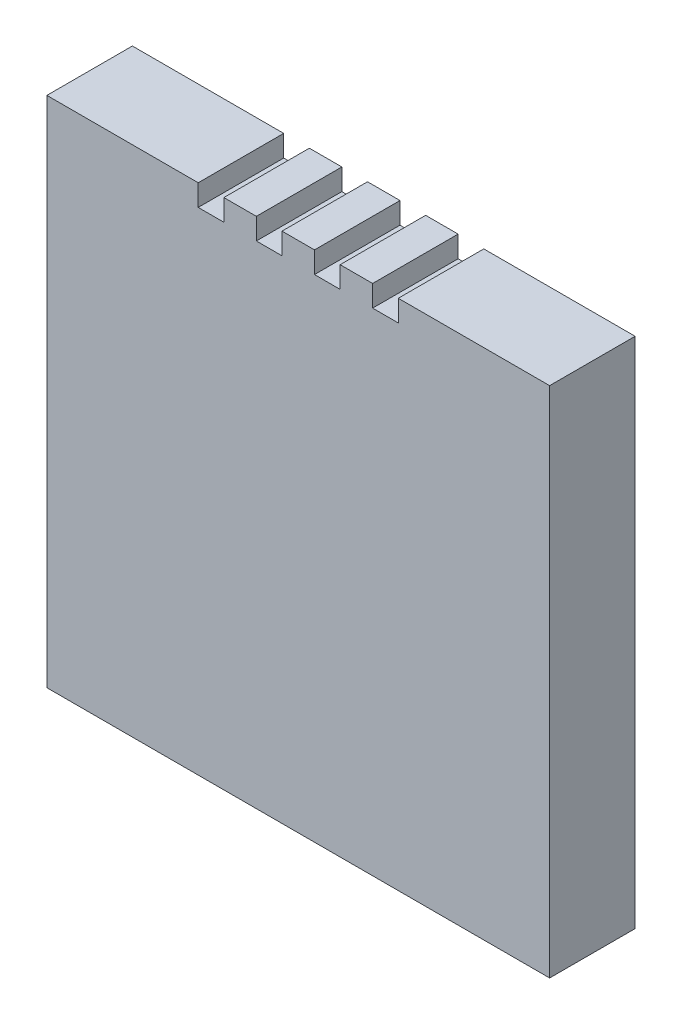
ISO-10303-21;
HEADER;
FILE_DESCRIPTION(('STEP AP214'),'2;1');
FILE_NAME('part.step','',(''),(''),'','','');
FILE_SCHEMA(('AUTOMOTIVE_DESIGN { 1 0 10303 214 1 1 1 1 }'));
ENDSEC;
DATA;
#1=APPLICATION_CONTEXT('core data for automotive mechanical design processes');
#2=APPLICATION_PROTOCOL_DEFINITION('international standard','automotive_design',2000,#1);
#3=PRODUCT_CONTEXT('',#1,'mechanical');
#4=PRODUCT('Part','Part','',(#3));
#5=PRODUCT_RELATED_PRODUCT_CATEGORY('part','',(#4));
#6=PRODUCT_DEFINITION_FORMATION('','',#4);
#7=PRODUCT_DEFINITION_CONTEXT('part definition',#1,'design');
#8=PRODUCT_DEFINITION('design','',#6,#7);
#9=PRODUCT_DEFINITION_SHAPE('','',#8);
#10=(LENGTH_UNIT() NAMED_UNIT(*) SI_UNIT(.MILLI.,.METRE.));
#11=(NAMED_UNIT(*) PLANE_ANGLE_UNIT() SI_UNIT($,.RADIAN.));
#12=(NAMED_UNIT(*) SI_UNIT($,.STERADIAN.) SOLID_ANGLE_UNIT());
#13=UNCERTAINTY_MEASURE_WITH_UNIT(LENGTH_MEASURE(1.E-05),#10,'distance_accuracy_value','');
#14=(GEOMETRIC_REPRESENTATION_CONTEXT(3) GLOBAL_UNCERTAINTY_ASSIGNED_CONTEXT((#13)) GLOBAL_UNIT_ASSIGNED_CONTEXT((#10,
#11,#12)) REPRESENTATION_CONTEXT('',''));
#15=CARTESIAN_POINT('',(0.,0.,0.));
#16=DIRECTION('',(0.,0.,1.));
#17=DIRECTION('',(1.,0.,0.));
#18=AXIS2_PLACEMENT_3D('',#15,#16,#17);
#19=CARTESIAN_POINT('',(0.,0.,2.));
#20=DIRECTION('',(0.,0.,1.));
#21=DIRECTION('',(1.,0.,0.));
#22=AXIS2_PLACEMENT_3D('',#19,#20,#21);
#23=PLANE('',#22);
#24=DIRECTION('',(0.,-1.,0.));
#25=VECTOR('',#24,1.);
#26=CARTESIAN_POINT('',(5.88,0.,2.));
#27=LINE('',#26,#25);
#28=CARTESIAN_POINT('',(5.88,5.99999999999999,2.));
#29=VERTEX_POINT('',#28);
#30=CARTESIAN_POINT('',(5.87999999999999,-6.00000000000001,2.));
#31=VERTEX_POINT('',#30);
#32=EDGE_CURVE('E59',#29,#31,#27,.T.);
#33=ORIENTED_EDGE('',*,*,#32,.F.);
#34=DIRECTION('',(-1.,0.,0.));
#35=VECTOR('',#34,1.);
#36=CARTESIAN_POINT('',(2.34,5.99999999999999,2.));
#37=LINE('',#36,#35);
#38=CARTESIAN_POINT('',(2.34,5.99999999999999,2.));
#39=VERTEX_POINT('',#38);
#40=EDGE_CURVE('E200',#29,#39,#37,.T.);
#41=ORIENTED_EDGE('',*,*,#40,.T.);
#42=DIRECTION('',(0.,-1.,0.));
#43=VECTOR('',#42,1.);
#44=CARTESIAN_POINT('',(2.34,5.49999999999999,2.));
#45=LINE('',#44,#43);
#46=CARTESIAN_POINT('',(2.34,5.49999999999999,2.));
#47=VERTEX_POINT('',#46);
#48=EDGE_CURVE('E205',#39,#47,#45,.T.);
#49=ORIENTED_EDGE('',*,*,#48,.T.);
#50=DIRECTION('',(-1.,0.,0.));
#51=VECTOR('',#50,1.);
#52=CARTESIAN_POINT('',(1.74,5.49999999999999,2.));
#53=LINE('',#52,#51);
#54=CARTESIAN_POINT('',(1.74,5.49999999999999,2.));
#55=VERTEX_POINT('',#54);
#56=EDGE_CURVE('E358',#47,#55,#53,.T.);
#57=ORIENTED_EDGE('',*,*,#56,.T.);
#58=DIRECTION('',(0.,1.,0.));
#59=VECTOR('',#58,1.);
#60=CARTESIAN_POINT('',(1.74,5.99999999999999,2.));
#61=LINE('',#60,#59);
#62=CARTESIAN_POINT('',(1.74,5.99999999999999,2.));
#63=VERTEX_POINT('',#62);
#64=EDGE_CURVE('E361',#55,#63,#61,.T.);
#65=ORIENTED_EDGE('',*,*,#64,.T.);
#66=DIRECTION('',(-1.,0.,0.));
#67=VECTOR('',#66,1.);
#68=CARTESIAN_POINT('',(0.980000000000001,5.99999999999999,2.));
#69=LINE('',#68,#67);
#70=CARTESIAN_POINT('',(0.980000000000001,5.99999999999999,2.));
#71=VERTEX_POINT('',#70);
#72=EDGE_CURVE('E364',#63,#71,#69,.T.);
#73=ORIENTED_EDGE('',*,*,#72,.T.);
#74=DIRECTION('',(0.,-1.,0.));
#75=VECTOR('',#74,1.);
#76=CARTESIAN_POINT('',(0.98,5.49999999999999,2.));
#77=LINE('',#76,#75);
#78=CARTESIAN_POINT('',(0.98,5.49999999999999,2.));
#79=VERTEX_POINT('',#78);
#80=EDGE_CURVE('E367',#71,#79,#77,.T.);
#81=ORIENTED_EDGE('',*,*,#80,.T.);
#82=DIRECTION('',(-1.,0.,0.));
#83=VECTOR('',#82,1.);
#84=CARTESIAN_POINT('',(0.38,5.49999999999999,2.));
#85=LINE('',#84,#83);
#86=CARTESIAN_POINT('',(0.38,5.49999999999999,2.));
#87=VERTEX_POINT('',#86);
#88=EDGE_CURVE('E370',#79,#87,#85,.T.);
#89=ORIENTED_EDGE('',*,*,#88,.T.);
#90=DIRECTION('',(0.,1.,0.));
#91=VECTOR('',#90,1.);
#92=CARTESIAN_POINT('',(0.38,5.99999999999999,2.));
#93=LINE('',#92,#91);
#94=CARTESIAN_POINT('',(0.38,5.99999999999999,2.));
#95=VERTEX_POINT('',#94);
#96=EDGE_CURVE('E373',#87,#95,#93,.T.);
#97=ORIENTED_EDGE('',*,*,#96,.T.);
#98=DIRECTION('',(-1.,0.,0.));
#99=VECTOR('',#98,1.);
#100=CARTESIAN_POINT('',(-0.379999999999999,5.99999999999999,2.));
#101=LINE('',#100,#99);
#102=CARTESIAN_POINT('',(-0.379999999999999,5.99999999999999,2.));
#103=VERTEX_POINT('',#102);
#104=EDGE_CURVE('E376',#95,#103,#101,.T.);
#105=ORIENTED_EDGE('',*,*,#104,.T.);
#106=DIRECTION('',(0.,-1.,0.));
#107=VECTOR('',#106,1.);
#108=CARTESIAN_POINT('',(-0.379999999999999,5.49999999999999,2.));
#109=LINE('',#108,#107);
#110=CARTESIAN_POINT('',(-0.379999999999999,5.49999999999999,2.));
#111=VERTEX_POINT('',#110);
#112=EDGE_CURVE('E379',#103,#111,#109,.T.);
#113=ORIENTED_EDGE('',*,*,#112,.T.);
#114=DIRECTION('',(-1.,0.,0.));
#115=VECTOR('',#114,1.);
#116=CARTESIAN_POINT('',(-0.980000000000001,5.49999999999999,2.));
#117=LINE('',#116,#115);
#118=CARTESIAN_POINT('',(-0.980000000000001,5.49999999999999,2.));
#119=VERTEX_POINT('',#118);
#120=EDGE_CURVE('E382',#111,#119,#117,.T.);
#121=ORIENTED_EDGE('',*,*,#120,.T.);
#122=DIRECTION('',(0.,1.,0.));
#123=VECTOR('',#122,1.);
#124=CARTESIAN_POINT('',(-0.98,5.99999999999999,2.));
#125=LINE('',#124,#123);
#126=CARTESIAN_POINT('',(-0.98,5.99999999999999,2.));
#127=VERTEX_POINT('',#126);
#128=EDGE_CURVE('E385',#119,#127,#125,.T.);
#129=ORIENTED_EDGE('',*,*,#128,.T.);
#130=DIRECTION('',(-1.,0.,0.));
#131=VECTOR('',#130,1.);
#132=CARTESIAN_POINT('',(-1.74,5.99999999999999,2.));
#133=LINE('',#132,#131);
#134=CARTESIAN_POINT('',(-1.74,5.99999999999999,2.));
#135=VERTEX_POINT('',#134);
#136=EDGE_CURVE('E388',#127,#135,#133,.T.);
#137=ORIENTED_EDGE('',*,*,#136,.T.);
#138=DIRECTION('',(0.,-1.,0.));
#139=VECTOR('',#138,1.);
#140=CARTESIAN_POINT('',(-1.74,5.49999999999999,2.));
#141=LINE('',#140,#139);
#142=CARTESIAN_POINT('',(-1.74,5.49999999999999,2.));
#143=VERTEX_POINT('',#142);
#144=EDGE_CURVE('E391',#135,#143,#141,.T.);
#145=ORIENTED_EDGE('',*,*,#144,.T.);
#146=DIRECTION('',(-1.,0.,0.));
#147=VECTOR('',#146,1.);
#148=CARTESIAN_POINT('',(-2.34,5.49999999999999,2.));
#149=LINE('',#148,#147);
#150=CARTESIAN_POINT('',(-2.34,5.49999999999999,2.));
#151=VERTEX_POINT('',#150);
#152=EDGE_CURVE('E394',#143,#151,#149,.T.);
#153=ORIENTED_EDGE('',*,*,#152,.T.);
#154=DIRECTION('',(0.,1.,0.));
#155=VECTOR('',#154,1.);
#156=CARTESIAN_POINT('',(-2.34,5.99999999999999,2.));
#157=LINE('',#156,#155);
#158=CARTESIAN_POINT('',(-2.34,5.99999999999999,2.));
#159=VERTEX_POINT('',#158);
#160=EDGE_CURVE('E397',#151,#159,#157,.T.);
#161=ORIENTED_EDGE('',*,*,#160,.T.);
#162=DIRECTION('',(-1.,0.,0.));
#163=VECTOR('',#162,1.);
#164=CARTESIAN_POINT('',(-10.5,5.99999999999999,2.));
#165=LINE('',#164,#163);
#166=CARTESIAN_POINT('',(-5.88,5.99999999999999,2.));
#167=VERTEX_POINT('',#166);
#168=EDGE_CURVE('E343',#159,#167,#165,.T.);
#169=ORIENTED_EDGE('',*,*,#168,.T.);
#170=DIRECTION('',(0.,1.,0.));
#171=VECTOR('',#170,1.);
#172=CARTESIAN_POINT('',(-5.88,0.,2.));
#173=LINE('',#172,#171);
#174=CARTESIAN_POINT('',(-5.88,-6.00000000000001,2.));
#175=VERTEX_POINT('',#174);
#176=EDGE_CURVE('E349',#175,#167,#173,.T.);
#177=ORIENTED_EDGE('',*,*,#176,.F.);
#178=DIRECTION('',(1.,0.,0.));
#179=VECTOR('',#178,1.);
#180=CARTESIAN_POINT('',(-10.5,-6.00000000000001,2.));
#181=LINE('',#180,#179);
#182=EDGE_CURVE('E217',#175,#31,#181,.T.);
#183=ORIENTED_EDGE('',*,*,#182,.T.);
#184=EDGE_LOOP('',(#33,#41,#49,#57,#65,#73,#81,#89,#97,#105,#113,#121,#129,#137,#145,#153,#161,
#169,#177,#183));
#185=FACE_BOUND('',#184,.T.);
#186=ADVANCED_FACE('F43',(#185),#23,.T.);
#187=CARTESIAN_POINT('',(0.,0.,0.));
#188=DIRECTION('',(0.,0.,1.));
#189=DIRECTION('',(1.,0.,0.));
#190=AXIS2_PLACEMENT_3D('',#187,#188,#189);
#191=PLANE('',#190);
#192=DIRECTION('',(-1.,0.,0.));
#193=VECTOR('',#192,1.);
#194=CARTESIAN_POINT('',(2.34,5.99999999999999,0.));
#195=LINE('',#194,#193);
#196=CARTESIAN_POINT('',(5.88,5.99999999999999,0.));
#197=VERTEX_POINT('',#196);
#198=CARTESIAN_POINT('',(2.34,5.99999999999999,0.));
#199=VERTEX_POINT('',#198);
#200=EDGE_CURVE('E194',#197,#199,#195,.T.);
#201=ORIENTED_EDGE('',*,*,#200,.F.);
#202=DIRECTION('',(0.,1.,0.));
#203=VECTOR('',#202,1.);
#204=CARTESIAN_POINT('',(5.88,-6.00000000000001,0.));
#205=LINE('',#204,#203);
#206=CARTESIAN_POINT('',(5.88,-6.00000000000001,0.));
#207=VERTEX_POINT('',#206);
#208=EDGE_CURVE('E180',#207,#197,#205,.T.);
#209=ORIENTED_EDGE('',*,*,#208,.F.);
#210=DIRECTION('',(1.,0.,0.));
#211=VECTOR('',#210,1.);
#212=CARTESIAN_POINT('',(-10.5,-6.00000000000001,0.));
#213=LINE('',#212,#211);
#214=CARTESIAN_POINT('',(-5.88,-6.00000000000001,0.));
#215=VERTEX_POINT('',#214);
#216=EDGE_CURVE('E192',#215,#207,#213,.T.);
#217=ORIENTED_EDGE('',*,*,#216,.F.);
#218=DIRECTION('',(0.,1.,0.));
#219=VECTOR('',#218,1.);
#220=CARTESIAN_POINT('',(-5.88,-6.00000000000001,0.));
#221=LINE('',#220,#219);
#222=CARTESIAN_POINT('',(-5.88,5.99999999999999,0.));
#223=VERTEX_POINT('',#222);
#224=EDGE_CURVE('E67',#215,#223,#221,.T.);
#225=ORIENTED_EDGE('',*,*,#224,.T.);
#226=DIRECTION('',(-1.,0.,0.));
#227=VECTOR('',#226,1.);
#228=CARTESIAN_POINT('',(-10.5,5.99999999999999,0.));
#229=LINE('',#228,#227);
#230=CARTESIAN_POINT('',(-2.34,5.99999999999999,0.));
#231=VERTEX_POINT('',#230);
#232=EDGE_CURVE('E201',#231,#223,#229,.T.);
#233=ORIENTED_EDGE('',*,*,#232,.F.);
#234=DIRECTION('',(0.,1.,0.));
#235=VECTOR('',#234,1.);
#236=CARTESIAN_POINT('',(-2.34,5.99999999999999,0.));
#237=LINE('',#236,#235);
#238=CARTESIAN_POINT('',(-2.34,5.49999999999999,0.));
#239=VERTEX_POINT('',#238);
#240=EDGE_CURVE('E208',#239,#231,#237,.T.);
#241=ORIENTED_EDGE('',*,*,#240,.F.);
#242=DIRECTION('',(-1.,0.,0.));
#243=VECTOR('',#242,1.);
#244=CARTESIAN_POINT('',(-2.34,5.49999999999999,0.));
#245=LINE('',#244,#243);
#246=CARTESIAN_POINT('',(-1.74,5.49999999999999,0.));
#247=VERTEX_POINT('',#246);
#248=EDGE_CURVE('E327',#247,#239,#245,.T.);
#249=ORIENTED_EDGE('',*,*,#248,.F.);
#250=DIRECTION('',(0.,-1.,0.));
#251=VECTOR('',#250,1.);
#252=CARTESIAN_POINT('',(-1.74,5.49999999999999,0.));
#253=LINE('',#252,#251);
#254=CARTESIAN_POINT('',(-1.74,5.99999999999999,0.));
#255=VERTEX_POINT('',#254);
#256=EDGE_CURVE('E324',#255,#247,#253,.T.);
#257=ORIENTED_EDGE('',*,*,#256,.F.);
#258=DIRECTION('',(-1.,0.,0.));
#259=VECTOR('',#258,1.);
#260=CARTESIAN_POINT('',(-1.74,5.99999999999999,0.));
#261=LINE('',#260,#259);
#262=CARTESIAN_POINT('',(-0.98,5.99999999999999,0.));
#263=VERTEX_POINT('',#262);
#264=EDGE_CURVE('E321',#263,#255,#261,.T.);
#265=ORIENTED_EDGE('',*,*,#264,.F.);
#266=DIRECTION('',(0.,1.,0.));
#267=VECTOR('',#266,1.);
#268=CARTESIAN_POINT('',(-0.98,5.99999999999999,0.));
#269=LINE('',#268,#267);
#270=CARTESIAN_POINT('',(-0.980000000000001,5.49999999999999,0.));
#271=VERTEX_POINT('',#270);
#272=EDGE_CURVE('E318',#271,#263,#269,.T.);
#273=ORIENTED_EDGE('',*,*,#272,.F.);
#274=DIRECTION('',(-1.,0.,0.));
#275=VECTOR('',#274,1.);
#276=CARTESIAN_POINT('',(-0.980000000000001,5.49999999999999,0.));
#277=LINE('',#276,#275);
#278=CARTESIAN_POINT('',(-0.379999999999999,5.49999999999999,0.));
#279=VERTEX_POINT('',#278);
#280=EDGE_CURVE('E315',#279,#271,#277,.T.);
#281=ORIENTED_EDGE('',*,*,#280,.F.);
#282=DIRECTION('',(0.,-1.,0.));
#283=VECTOR('',#282,1.);
#284=CARTESIAN_POINT('',(-0.379999999999999,5.49999999999999,0.));
#285=LINE('',#284,#283);
#286=CARTESIAN_POINT('',(-0.379999999999999,5.99999999999999,0.));
#287=VERTEX_POINT('',#286);
#288=EDGE_CURVE('E312',#287,#279,#285,.T.);
#289=ORIENTED_EDGE('',*,*,#288,.F.);
#290=DIRECTION('',(-1.,0.,0.));
#291=VECTOR('',#290,1.);
#292=CARTESIAN_POINT('',(-0.379999999999999,5.99999999999999,0.));
#293=LINE('',#292,#291);
#294=CARTESIAN_POINT('',(0.38,5.99999999999999,0.));
#295=VERTEX_POINT('',#294);
#296=EDGE_CURVE('E309',#295,#287,#293,.T.);
#297=ORIENTED_EDGE('',*,*,#296,.F.);
#298=DIRECTION('',(0.,1.,0.));
#299=VECTOR('',#298,1.);
#300=CARTESIAN_POINT('',(0.38,5.99999999999999,0.));
#301=LINE('',#300,#299);
#302=CARTESIAN_POINT('',(0.38,5.49999999999999,0.));
#303=VERTEX_POINT('',#302);
#304=EDGE_CURVE('E306',#303,#295,#301,.T.);
#305=ORIENTED_EDGE('',*,*,#304,.F.);
#306=DIRECTION('',(-1.,0.,0.));
#307=VECTOR('',#306,1.);
#308=CARTESIAN_POINT('',(0.38,5.49999999999999,0.));
#309=LINE('',#308,#307);
#310=CARTESIAN_POINT('',(0.98,5.49999999999999,0.));
#311=VERTEX_POINT('',#310);
#312=EDGE_CURVE('E303',#311,#303,#309,.T.);
#313=ORIENTED_EDGE('',*,*,#312,.F.);
#314=DIRECTION('',(0.,-1.,0.));
#315=VECTOR('',#314,1.);
#316=CARTESIAN_POINT('',(0.98,5.49999999999999,0.));
#317=LINE('',#316,#315);
#318=CARTESIAN_POINT('',(0.980000000000001,5.99999999999999,0.));
#319=VERTEX_POINT('',#318);
#320=EDGE_CURVE('E300',#319,#311,#317,.T.);
#321=ORIENTED_EDGE('',*,*,#320,.F.);
#322=DIRECTION('',(-1.,0.,0.));
#323=VECTOR('',#322,1.);
#324=CARTESIAN_POINT('',(0.980000000000001,5.99999999999999,0.));
#325=LINE('',#324,#323);
#326=CARTESIAN_POINT('',(1.74,5.99999999999999,0.));
#327=VERTEX_POINT('',#326);
#328=EDGE_CURVE('E297',#327,#319,#325,.T.);
#329=ORIENTED_EDGE('',*,*,#328,.F.);
#330=DIRECTION('',(0.,1.,0.));
#331=VECTOR('',#330,1.);
#332=CARTESIAN_POINT('',(1.74,5.99999999999999,0.));
#333=LINE('',#332,#331);
#334=CARTESIAN_POINT('',(1.74,5.49999999999999,0.));
#335=VERTEX_POINT('',#334);
#336=EDGE_CURVE('E291',#335,#327,#333,.T.);
#337=ORIENTED_EDGE('',*,*,#336,.F.);
#338=DIRECTION('',(-1.,0.,0.));
#339=VECTOR('',#338,1.);
#340=CARTESIAN_POINT('',(1.74,5.49999999999999,0.));
#341=LINE('',#340,#339);
#342=CARTESIAN_POINT('',(2.34,5.49999999999999,0.));
#343=VERTEX_POINT('',#342);
#344=EDGE_CURVE('E287',#343,#335,#341,.T.);
#345=ORIENTED_EDGE('',*,*,#344,.F.);
#346=DIRECTION('',(0.,-1.,0.));
#347=VECTOR('',#346,1.);
#348=CARTESIAN_POINT('',(2.34,5.49999999999999,0.));
#349=LINE('',#348,#347);
#350=EDGE_CURVE('E279',#199,#343,#349,.T.);
#351=ORIENTED_EDGE('',*,*,#350,.F.);
#352=EDGE_LOOP('',(#201,#209,#217,#225,#233,#241,#249,#257,#265,#273,#281,#289,#297,#305,#313,
#321,#329,#337,#345,#351));
#353=FACE_BOUND('',#352,.T.);
#354=ADVANCED_FACE('F191',(#353),#191,.F.);
#355=CARTESIAN_POINT('',(2.34,5.99999999999999,2.));
#356=DIRECTION('',(0.,-1.,0.));
#357=DIRECTION('',(0.,0.,-1.));
#358=AXIS2_PLACEMENT_3D('',#355,#356,#357);
#359=PLANE('',#358);
#360=ORIENTED_EDGE('',*,*,#40,.F.);
#361=DIRECTION('',(0.,0.,-1.));
#362=VECTOR('',#361,1.);
#363=CARTESIAN_POINT('',(5.88,5.99999999999999,2.));
#364=LINE('',#363,#362);
#365=EDGE_CURVE('E282',#29,#197,#364,.T.);
#366=ORIENTED_EDGE('',*,*,#365,.T.);
#367=ORIENTED_EDGE('',*,*,#200,.T.);
#368=DIRECTION('',(0.,0.,-1.));
#369=VECTOR('',#368,1.);
#370=CARTESIAN_POINT('',(2.34,5.99999999999999,2.));
#371=LINE('',#370,#369);
#372=EDGE_CURVE('E52',#39,#199,#371,.T.);
#373=ORIENTED_EDGE('',*,*,#372,.F.);
#374=EDGE_LOOP('',(#360,#366,#367,#373));
#375=FACE_BOUND('',#374,.T.);
#376=ADVANCED_FACE('F45',(#375),#359,.F.);
#377=CARTESIAN_POINT('',(2.34,5.49999999999999,2.));
#378=DIRECTION('',(1.,0.,0.));
#379=DIRECTION('',(0.,0.,-1.));
#380=AXIS2_PLACEMENT_3D('',#377,#378,#379);
#381=PLANE('',#380);
#382=ORIENTED_EDGE('',*,*,#350,.T.);
#383=DIRECTION('',(0.,0.,-1.));
#384=VECTOR('',#383,1.);
#385=CARTESIAN_POINT('',(2.34,5.49999999999999,2.));
#386=LINE('',#385,#384);
#387=EDGE_CURVE('E269',#47,#343,#386,.T.);
#388=ORIENTED_EDGE('',*,*,#387,.F.);
#389=ORIENTED_EDGE('',*,*,#48,.F.);
#390=ORIENTED_EDGE('',*,*,#372,.T.);
#391=EDGE_LOOP('',(#382,#388,#389,#390));
#392=FACE_BOUND('',#391,.T.);
#393=ADVANCED_FACE('F277',(#392),#381,.F.);
#394=CARTESIAN_POINT('',(1.74,5.49999999999999,2.));
#395=DIRECTION('',(0.,-1.,0.));
#396=DIRECTION('',(1.,0.,0.));
#397=AXIS2_PLACEMENT_3D('',#394,#395,#396);
#398=PLANE('',#397);
#399=ORIENTED_EDGE('',*,*,#344,.T.);
#400=DIRECTION('',(0.,0.,-1.));
#401=VECTOR('',#400,1.);
#402=CARTESIAN_POINT('',(1.74,5.49999999999999,2.));
#403=LINE('',#402,#401);
#404=EDGE_CURVE('E265',#55,#335,#403,.T.);
#405=ORIENTED_EDGE('',*,*,#404,.F.);
#406=ORIENTED_EDGE('',*,*,#56,.F.);
#407=ORIENTED_EDGE('',*,*,#387,.T.);
#408=EDGE_LOOP('',(#399,#405,#406,#407));
#409=FACE_BOUND('',#408,.T.);
#410=ADVANCED_FACE('F471',(#409),#398,.F.);
#411=CARTESIAN_POINT('',(1.74,5.99999999999999,2.));
#412=DIRECTION('',(-1.,0.,0.));
#413=DIRECTION('',(0.,-1.,0.));
#414=AXIS2_PLACEMENT_3D('',#411,#412,#413);
#415=PLANE('',#414);
#416=ORIENTED_EDGE('',*,*,#336,.T.);
#417=DIRECTION('',(0.,0.,-1.));
#418=VECTOR('',#417,1.);
#419=CARTESIAN_POINT('',(1.74,5.99999999999999,2.));
#420=LINE('',#419,#418);
#421=EDGE_CURVE('E261',#63,#327,#420,.T.);
#422=ORIENTED_EDGE('',*,*,#421,.F.);
#423=ORIENTED_EDGE('',*,*,#64,.F.);
#424=ORIENTED_EDGE('',*,*,#404,.T.);
#425=EDGE_LOOP('',(#416,#422,#423,#424));
#426=FACE_BOUND('',#425,.T.);
#427=ADVANCED_FACE('F467',(#426),#415,.F.);
#428=CARTESIAN_POINT('',(0.980000000000001,5.99999999999999,2.));
#429=DIRECTION('',(0.,-1.,0.));
#430=DIRECTION('',(0.,0.,-1.));
#431=AXIS2_PLACEMENT_3D('',#428,#429,#430);
#432=PLANE('',#431);
#433=ORIENTED_EDGE('',*,*,#328,.T.);
#434=DIRECTION('',(0.,0.,-1.));
#435=VECTOR('',#434,1.);
#436=CARTESIAN_POINT('',(0.980000000000001,5.99999999999999,2.));
#437=LINE('',#436,#435);
#438=EDGE_CURVE('E257',#71,#319,#437,.T.);
#439=ORIENTED_EDGE('',*,*,#438,.F.);
#440=ORIENTED_EDGE('',*,*,#72,.F.);
#441=ORIENTED_EDGE('',*,*,#421,.T.);
#442=EDGE_LOOP('',(#433,#439,#440,#441));
#443=FACE_BOUND('',#442,.T.);
#444=ADVANCED_FACE('F463',(#443),#432,.F.);
#445=CARTESIAN_POINT('',(0.98,5.49999999999999,2.));
#446=DIRECTION('',(1.,0.,0.));
#447=DIRECTION('',(0.,1.,0.));
#448=AXIS2_PLACEMENT_3D('',#445,#446,#447);
#449=PLANE('',#448);
#450=ORIENTED_EDGE('',*,*,#320,.T.);
#451=DIRECTION('',(0.,0.,-1.));
#452=VECTOR('',#451,1.);
#453=CARTESIAN_POINT('',(0.98,5.49999999999999,2.));
#454=LINE('',#453,#452);
#455=EDGE_CURVE('E253',#79,#311,#454,.T.);
#456=ORIENTED_EDGE('',*,*,#455,.F.);
#457=ORIENTED_EDGE('',*,*,#80,.F.);
#458=ORIENTED_EDGE('',*,*,#438,.T.);
#459=EDGE_LOOP('',(#450,#456,#457,#458));
#460=FACE_BOUND('',#459,.T.);
#461=ADVANCED_FACE('F459',(#460),#449,.F.);
#462=CARTESIAN_POINT('',(0.38,5.49999999999999,2.));
#463=DIRECTION('',(0.,-1.,0.));
#464=DIRECTION('',(1.,0.,0.));
#465=AXIS2_PLACEMENT_3D('',#462,#463,#464);
#466=PLANE('',#465);
#467=ORIENTED_EDGE('',*,*,#312,.T.);
#468=DIRECTION('',(0.,0.,-1.));
#469=VECTOR('',#468,1.);
#470=CARTESIAN_POINT('',(0.38,5.49999999999999,2.));
#471=LINE('',#470,#469);
#472=EDGE_CURVE('E249',#87,#303,#471,.T.);
#473=ORIENTED_EDGE('',*,*,#472,.F.);
#474=ORIENTED_EDGE('',*,*,#88,.F.);
#475=ORIENTED_EDGE('',*,*,#455,.T.);
#476=EDGE_LOOP('',(#467,#473,#474,#475));
#477=FACE_BOUND('',#476,.T.);
#478=ADVANCED_FACE('F455',(#477),#466,.F.);
#479=CARTESIAN_POINT('',(0.38,5.99999999999999,2.));
#480=DIRECTION('',(-1.,0.,0.));
#481=DIRECTION('',(0.,-1.,0.));
#482=AXIS2_PLACEMENT_3D('',#479,#480,#481);
#483=PLANE('',#482);
#484=ORIENTED_EDGE('',*,*,#304,.T.);
#485=DIRECTION('',(0.,0.,-1.));
#486=VECTOR('',#485,1.);
#487=CARTESIAN_POINT('',(0.38,5.99999999999999,2.));
#488=LINE('',#487,#486);
#489=EDGE_CURVE('E245',#95,#295,#488,.T.);
#490=ORIENTED_EDGE('',*,*,#489,.F.);
#491=ORIENTED_EDGE('',*,*,#96,.F.);
#492=ORIENTED_EDGE('',*,*,#472,.T.);
#493=EDGE_LOOP('',(#484,#490,#491,#492));
#494=FACE_BOUND('',#493,.T.);
#495=ADVANCED_FACE('F451',(#494),#483,.F.);
#496=CARTESIAN_POINT('',(-0.379999999999999,5.99999999999999,2.));
#497=DIRECTION('',(0.,-1.,0.));
#498=DIRECTION('',(0.,0.,-1.));
#499=AXIS2_PLACEMENT_3D('',#496,#497,#498);
#500=PLANE('',#499);
#501=ORIENTED_EDGE('',*,*,#296,.T.);
#502=DIRECTION('',(0.,0.,-1.));
#503=VECTOR('',#502,1.);
#504=CARTESIAN_POINT('',(-0.379999999999999,5.99999999999999,2.));
#505=LINE('',#504,#503);
#506=EDGE_CURVE('E241',#103,#287,#505,.T.);
#507=ORIENTED_EDGE('',*,*,#506,.F.);
#508=ORIENTED_EDGE('',*,*,#104,.F.);
#509=ORIENTED_EDGE('',*,*,#489,.T.);
#510=EDGE_LOOP('',(#501,#507,#508,#509));
#511=FACE_BOUND('',#510,.T.);
#512=ADVANCED_FACE('F447',(#511),#500,.F.);
#513=CARTESIAN_POINT('',(-0.379999999999999,5.49999999999999,2.));
#514=DIRECTION('',(1.,0.,0.));
#515=DIRECTION('',(0.,1.,0.));
#516=AXIS2_PLACEMENT_3D('',#513,#514,#515);
#517=PLANE('',#516);
#518=ORIENTED_EDGE('',*,*,#288,.T.);
#519=DIRECTION('',(0.,0.,-1.));
#520=VECTOR('',#519,1.);
#521=CARTESIAN_POINT('',(-0.379999999999999,5.49999999999999,2.));
#522=LINE('',#521,#520);
#523=EDGE_CURVE('E237',#111,#279,#522,.T.);
#524=ORIENTED_EDGE('',*,*,#523,.F.);
#525=ORIENTED_EDGE('',*,*,#112,.F.);
#526=ORIENTED_EDGE('',*,*,#506,.T.);
#527=EDGE_LOOP('',(#518,#524,#525,#526));
#528=FACE_BOUND('',#527,.T.);
#529=ADVANCED_FACE('F443',(#528),#517,.F.);
#530=CARTESIAN_POINT('',(-0.980000000000001,5.49999999999999,2.));
#531=DIRECTION('',(0.,-1.,0.));
#532=DIRECTION('',(0.,0.,-1.));
#533=AXIS2_PLACEMENT_3D('',#530,#531,#532);
#534=PLANE('',#533);
#535=ORIENTED_EDGE('',*,*,#280,.T.);
#536=DIRECTION('',(0.,0.,-1.));
#537=VECTOR('',#536,1.);
#538=CARTESIAN_POINT('',(-0.980000000000001,5.49999999999999,2.));
#539=LINE('',#538,#537);
#540=EDGE_CURVE('E233',#119,#271,#539,.T.);
#541=ORIENTED_EDGE('',*,*,#540,.F.);
#542=ORIENTED_EDGE('',*,*,#120,.F.);
#543=ORIENTED_EDGE('',*,*,#523,.T.);
#544=EDGE_LOOP('',(#535,#541,#542,#543));
#545=FACE_BOUND('',#544,.T.);
#546=ADVANCED_FACE('F439',(#545),#534,.F.);
#547=CARTESIAN_POINT('',(-0.98,5.99999999999999,2.));
#548=DIRECTION('',(-1.,0.,0.));
#549=DIRECTION('',(0.,-1.,0.));
#550=AXIS2_PLACEMENT_3D('',#547,#548,#549);
#551=PLANE('',#550);
#552=ORIENTED_EDGE('',*,*,#272,.T.);
#553=DIRECTION('',(0.,0.,-1.));
#554=VECTOR('',#553,1.);
#555=CARTESIAN_POINT('',(-0.98,5.99999999999999,2.));
#556=LINE('',#555,#554);
#557=EDGE_CURVE('E229',#127,#263,#556,.T.);
#558=ORIENTED_EDGE('',*,*,#557,.F.);
#559=ORIENTED_EDGE('',*,*,#128,.F.);
#560=ORIENTED_EDGE('',*,*,#540,.T.);
#561=EDGE_LOOP('',(#552,#558,#559,#560));
#562=FACE_BOUND('',#561,.T.);
#563=ADVANCED_FACE('F435',(#562),#551,.F.);
#564=CARTESIAN_POINT('',(-1.74,5.99999999999999,2.));
#565=DIRECTION('',(0.,-1.,0.));
#566=DIRECTION('',(0.,0.,-1.));
#567=AXIS2_PLACEMENT_3D('',#564,#565,#566);
#568=PLANE('',#567);
#569=ORIENTED_EDGE('',*,*,#264,.T.);
#570=DIRECTION('',(0.,0.,-1.));
#571=VECTOR('',#570,1.);
#572=CARTESIAN_POINT('',(-1.74,5.99999999999999,2.));
#573=LINE('',#572,#571);
#574=EDGE_CURVE('E225',#135,#255,#573,.T.);
#575=ORIENTED_EDGE('',*,*,#574,.F.);
#576=ORIENTED_EDGE('',*,*,#136,.F.);
#577=ORIENTED_EDGE('',*,*,#557,.T.);
#578=EDGE_LOOP('',(#569,#575,#576,#577));
#579=FACE_BOUND('',#578,.T.);
#580=ADVANCED_FACE('F431',(#579),#568,.F.);
#581=CARTESIAN_POINT('',(-1.74,5.49999999999999,2.));
#582=DIRECTION('',(1.,0.,0.));
#583=DIRECTION('',(0.,1.,0.));
#584=AXIS2_PLACEMENT_3D('',#581,#582,#583);
#585=PLANE('',#584);
#586=ORIENTED_EDGE('',*,*,#256,.T.);
#587=DIRECTION('',(0.,0.,-1.));
#588=VECTOR('',#587,1.);
#589=CARTESIAN_POINT('',(-1.74,5.49999999999999,2.));
#590=LINE('',#589,#588);
#591=EDGE_CURVE('E221',#143,#247,#590,.T.);
#592=ORIENTED_EDGE('',*,*,#591,.F.);
#593=ORIENTED_EDGE('',*,*,#144,.F.);
#594=ORIENTED_EDGE('',*,*,#574,.T.);
#595=EDGE_LOOP('',(#586,#592,#593,#594));
#596=FACE_BOUND('',#595,.T.);
#597=ADVANCED_FACE('F427',(#596),#585,.F.);
#598=CARTESIAN_POINT('',(-2.34,5.49999999999999,2.));
#599=DIRECTION('',(0.,-1.,0.));
#600=DIRECTION('',(1.,0.,0.));
#601=AXIS2_PLACEMENT_3D('',#598,#599,#600);
#602=PLANE('',#601);
#603=ORIENTED_EDGE('',*,*,#248,.T.);
#604=DIRECTION('',(0.,0.,-1.));
#605=VECTOR('',#604,1.);
#606=CARTESIAN_POINT('',(-2.34,5.49999999999999,2.));
#607=LINE('',#606,#605);
#608=EDGE_CURVE('E216',#151,#239,#607,.T.);
#609=ORIENTED_EDGE('',*,*,#608,.F.);
#610=ORIENTED_EDGE('',*,*,#152,.F.);
#611=ORIENTED_EDGE('',*,*,#591,.T.);
#612=EDGE_LOOP('',(#603,#609,#610,#611));
#613=FACE_BOUND('',#612,.T.);
#614=ADVANCED_FACE('F424',(#613),#602,.F.);
#615=CARTESIAN_POINT('',(-2.34,5.99999999999999,2.));
#616=DIRECTION('',(-1.,0.,0.));
#617=DIRECTION('',(0.,-1.,0.));
#618=AXIS2_PLACEMENT_3D('',#615,#616,#617);
#619=PLANE('',#618);
#620=ORIENTED_EDGE('',*,*,#240,.T.);
#621=DIRECTION('',(0.,0.,-1.));
#622=VECTOR('',#621,1.);
#623=CARTESIAN_POINT('',(-2.34,5.99999999999999,2.));
#624=LINE('',#623,#622);
#625=EDGE_CURVE('E212',#159,#231,#624,.T.);
#626=ORIENTED_EDGE('',*,*,#625,.F.);
#627=ORIENTED_EDGE('',*,*,#160,.F.);
#628=ORIENTED_EDGE('',*,*,#608,.T.);
#629=EDGE_LOOP('',(#620,#626,#627,#628));
#630=FACE_BOUND('',#629,.T.);
#631=ADVANCED_FACE('F333',(#630),#619,.F.);
#632=CARTESIAN_POINT('',(-10.5,5.99999999999999,2.));
#633=DIRECTION('',(0.,-1.,0.));
#634=DIRECTION('',(0.,0.,-1.));
#635=AXIS2_PLACEMENT_3D('',#632,#633,#634);
#636=PLANE('',#635);
#637=ORIENTED_EDGE('',*,*,#232,.T.);
#638=DIRECTION('',(0.,0.,1.));
#639=VECTOR('',#638,1.);
#640=CARTESIAN_POINT('',(-5.88,5.99999999999999,2.));
#641=LINE('',#640,#639);
#642=EDGE_CURVE('E196',#223,#167,#641,.T.);
#643=ORIENTED_EDGE('',*,*,#642,.T.);
#644=ORIENTED_EDGE('',*,*,#168,.F.);
#645=ORIENTED_EDGE('',*,*,#625,.T.);
#646=EDGE_LOOP('',(#637,#643,#644,#645));
#647=FACE_BOUND('',#646,.T.);
#648=ADVANCED_FACE('F340',(#647),#636,.F.);
#649=CARTESIAN_POINT('',(-10.5,-6.00000000000001,2.));
#650=DIRECTION('',(0.,1.,0.));
#651=DIRECTION('',(0.,0.,1.));
#652=AXIS2_PLACEMENT_3D('',#649,#650,#651);
#653=PLANE('',#652);
#654=ORIENTED_EDGE('',*,*,#216,.T.);
#655=DIRECTION('',(0.,0.,1.));
#656=VECTOR('',#655,1.);
#657=CARTESIAN_POINT('',(5.88,-6.00000000000001,0.));
#658=LINE('',#657,#656);
#659=EDGE_CURVE('E177',#207,#31,#658,.T.);
#660=ORIENTED_EDGE('',*,*,#659,.T.);
#661=ORIENTED_EDGE('',*,*,#182,.F.);
#662=DIRECTION('',(0.,0.,-1.));
#663=VECTOR('',#662,1.);
#664=CARTESIAN_POINT('',(-5.88,-6.00000000000001,2.));
#665=LINE('',#664,#663);
#666=EDGE_CURVE('E11',#175,#215,#665,.T.);
#667=ORIENTED_EDGE('',*,*,#666,.T.);
#668=EDGE_LOOP('',(#654,#660,#661,#667));
#669=FACE_BOUND('',#668,.T.);
#670=ADVANCED_FACE('F198',(#669),#653,.F.);
#671=CARTESIAN_POINT('',(-5.88,-6.00000000000001,0.));
#672=DIRECTION('',(1.,0.,0.));
#673=DIRECTION('',(0.,0.,-1.));
#674=AXIS2_PLACEMENT_3D('',#671,#672,#673);
#675=PLANE('',#674);
#676=ORIENTED_EDGE('',*,*,#176,.T.);
#677=ORIENTED_EDGE('',*,*,#642,.F.);
#678=ORIENTED_EDGE('',*,*,#224,.F.);
#679=ORIENTED_EDGE('',*,*,#666,.F.);
#680=EDGE_LOOP('',(#676,#677,#678,#679));
#681=FACE_BOUND('',#680,.T.);
#682=ADVANCED_FACE('F404',(#681),#675,.F.);
#683=CARTESIAN_POINT('',(5.88,-6.00000000000001,0.));
#684=DIRECTION('',(-1.,0.,0.));
#685=DIRECTION('',(0.,0.,1.));
#686=AXIS2_PLACEMENT_3D('',#683,#684,#685);
#687=PLANE('',#686);
#688=ORIENTED_EDGE('',*,*,#32,.T.);
#689=ORIENTED_EDGE('',*,*,#659,.F.);
#690=ORIENTED_EDGE('',*,*,#208,.T.);
#691=ORIENTED_EDGE('',*,*,#365,.F.);
#692=EDGE_LOOP('',(#688,#689,#690,#691));
#693=FACE_BOUND('',#692,.T.);
#694=ADVANCED_FACE('F179',(#693),#687,.F.);
#695=CLOSED_SHELL('',(#186,#354,#376,#393,#410,#427,#444,#461,#478,#495,#512,#529,#546,#563,
#580,#597,#614,#631,#648,#670,#682,#694));
#696=MANIFOLD_SOLID_BREP('B2',#695);
#697=ADVANCED_BREP_SHAPE_REPRESENTATION('',(#18,#696),#14);
#698=SHAPE_DEFINITION_REPRESENTATION(#9,#697);
ENDSEC;
END-ISO-10303-21;
